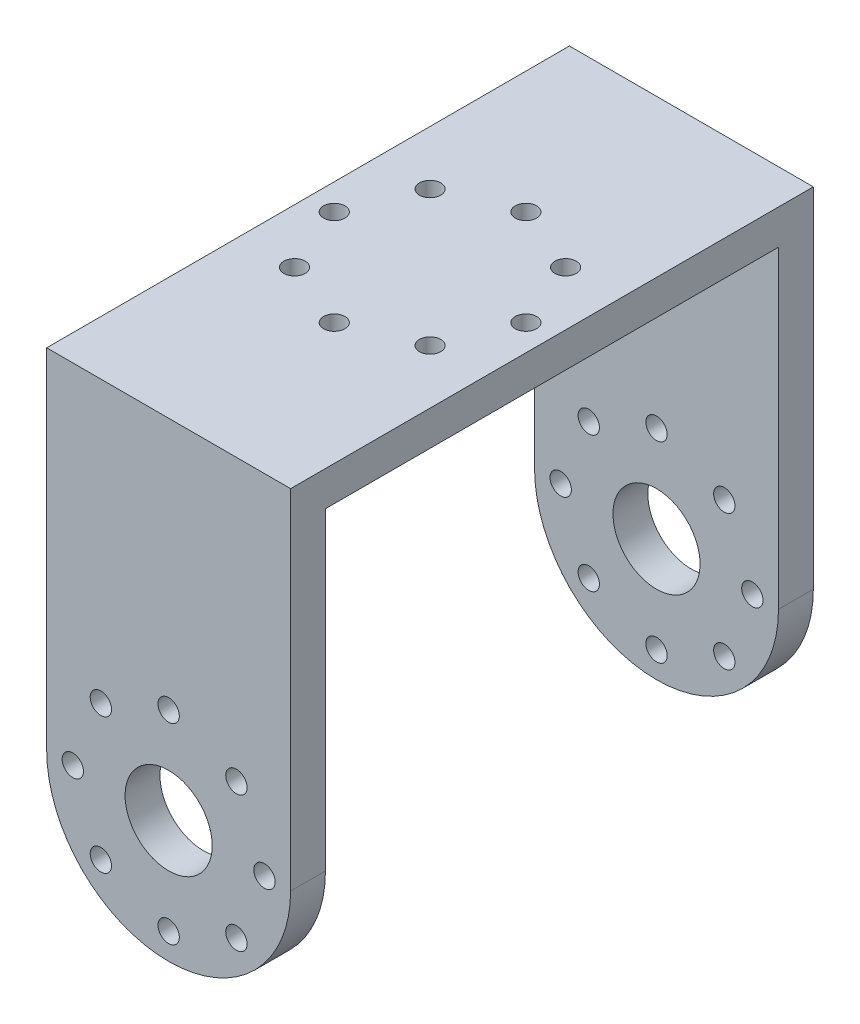
ISO-10303-21;
HEADER;
FILE_DESCRIPTION(('STEP AP214'),'2;1');
FILE_NAME('part.step','',(''),(''),'','','');
FILE_SCHEMA(('AUTOMOTIVE_DESIGN { 1 0 10303 214 1 1 1 1 }'));
ENDSEC;
DATA;
#1=APPLICATION_CONTEXT('core data for automotive mechanical design processes');
#2=APPLICATION_PROTOCOL_DEFINITION('international standard','automotive_design',2000,#1);
#3=PRODUCT_CONTEXT('',#1,'mechanical');
#4=PRODUCT('Part','Part','',(#3));
#5=PRODUCT_RELATED_PRODUCT_CATEGORY('part','',(#4));
#6=PRODUCT_DEFINITION_FORMATION('','',#4);
#7=PRODUCT_DEFINITION_CONTEXT('part definition',#1,'design');
#8=PRODUCT_DEFINITION('design','',#6,#7);
#9=PRODUCT_DEFINITION_SHAPE('','',#8);
#10=(LENGTH_UNIT() NAMED_UNIT(*) SI_UNIT(.MILLI.,.METRE.));
#11=(NAMED_UNIT(*) PLANE_ANGLE_UNIT() SI_UNIT($,.RADIAN.));
#12=(NAMED_UNIT(*) SI_UNIT($,.STERADIAN.) SOLID_ANGLE_UNIT());
#13=UNCERTAINTY_MEASURE_WITH_UNIT(LENGTH_MEASURE(1.E-05),#10,'distance_accuracy_value','');
#14=(GEOMETRIC_REPRESENTATION_CONTEXT(3) GLOBAL_UNCERTAINTY_ASSIGNED_CONTEXT((#13)) GLOBAL_UNIT_ASSIGNED_CONTEXT((#10,
#11,#12)) REPRESENTATION_CONTEXT('',''));
#15=CARTESIAN_POINT('',(0.,0.,0.));
#16=DIRECTION('',(0.,0.,1.));
#17=DIRECTION('',(1.,0.,0.));
#18=AXIS2_PLACEMENT_3D('',#15,#16,#17);
#19=CARTESIAN_POINT('',(0.,0.,60.));
#20=DIRECTION('',(0.,0.,-1.));
#21=DIRECTION('',(-1.,0.,0.));
#22=AXIS2_PLACEMENT_3D('',#19,#20,#21);
#23=CYLINDRICAL_SURFACE('',#22,14.);
#24=CARTESIAN_POINT('',(0.,0.,56.));
#25=DIRECTION('',(0.,0.,1.));
#26=DIRECTION('',(0.,-1.,0.));
#27=AXIS2_PLACEMENT_3D('',#24,#25,#26);
#28=CIRCLE('',#27,14.);
#29=CARTESIAN_POINT('',(-14.,0.,56.));
#30=VERTEX_POINT('',#29);
#31=CARTESIAN_POINT('',(14.,0.,56.));
#32=VERTEX_POINT('',#31);
#33=EDGE_CURVE('E187',#30,#32,#28,.T.);
#34=ORIENTED_EDGE('',*,*,#33,.T.);
#35=DIRECTION('',(0.,0.,-1.));
#36=VECTOR('',#35,1.);
#37=CARTESIAN_POINT('',(14.,0.,60.));
#38=LINE('',#37,#36);
#39=CARTESIAN_POINT('',(14.,0.,60.));
#40=VERTEX_POINT('',#39);
#41=EDGE_CURVE('E42',#40,#32,#38,.T.);
#42=ORIENTED_EDGE('',*,*,#41,.F.);
#43=CARTESIAN_POINT('',(0.,0.,60.));
#44=DIRECTION('',(0.,0.,1.));
#45=DIRECTION('',(1.,0.,0.));
#46=AXIS2_PLACEMENT_3D('',#43,#44,#45);
#47=CIRCLE('',#46,14.);
#48=CARTESIAN_POINT('',(-14.,0.,60.));
#49=VERTEX_POINT('',#48);
#50=EDGE_CURVE('E244',#49,#40,#47,.T.);
#51=ORIENTED_EDGE('',*,*,#50,.F.);
#52=DIRECTION('',(0.,0.,-1.));
#53=VECTOR('',#52,1.);
#54=CARTESIAN_POINT('',(-14.,0.,60.));
#55=LINE('',#54,#53);
#56=EDGE_CURVE('E257',#49,#30,#55,.T.);
#57=ORIENTED_EDGE('',*,*,#56,.T.);
#58=EDGE_LOOP('',(#34,#42,#51,#57));
#59=FACE_BOUND('',#58,.T.);
#60=ADVANCED_FACE('F33',(#59),#23,.T.);
#61=CARTESIAN_POINT('',(0.,0.,60.));
#62=DIRECTION('',(0.,0.,-1.));
#63=DIRECTION('',(-1.,0.,0.));
#64=AXIS2_PLACEMENT_3D('',#61,#62,#63);
#65=CYLINDRICAL_SURFACE('',#64,5.);
#66=CARTESIAN_POINT('',(0.,0.,56.));
#67=DIRECTION('',(0.,0.,1.));
#68=DIRECTION('',(0.,-1.,0.));
#69=AXIS2_PLACEMENT_3D('',#66,#67,#68);
#70=CIRCLE('',#69,5.);
#71=CARTESIAN_POINT('',(0.,-5.,56.));
#72=VERTEX_POINT('',#71);
#73=EDGE_CURVE('E181',#72,#72,#70,.T.);
#74=ORIENTED_EDGE('',*,*,#73,.F.);
#75=EDGE_LOOP('',(#74));
#76=FACE_BOUND('',#75,.T.);
#77=CARTESIAN_POINT('',(0.,0.,60.));
#78=DIRECTION('',(0.,0.,1.));
#79=DIRECTION('',(1.,0.,0.));
#80=AXIS2_PLACEMENT_3D('',#77,#78,#79);
#81=CIRCLE('',#80,5.);
#82=CARTESIAN_POINT('',(5.,0.,60.));
#83=VERTEX_POINT('',#82);
#84=EDGE_CURVE('E238',#83,#83,#81,.T.);
#85=ORIENTED_EDGE('',*,*,#84,.T.);
#86=EDGE_LOOP('',(#85));
#87=FACE_BOUND('',#86,.T.);
#88=ADVANCED_FACE('F370',(#76,#87),#65,.F.);
#89=CARTESIAN_POINT('',(0.,11.,60.));
#90=DIRECTION('',(0.,0.,-1.));
#91=DIRECTION('',(-1.,0.,0.));
#92=AXIS2_PLACEMENT_3D('',#89,#90,#91);
#93=CYLINDRICAL_SURFACE('',#92,1.22499999999995);
#94=CARTESIAN_POINT('',(0.,11.,56.));
#95=DIRECTION('',(0.,0.,1.));
#96=DIRECTION('',(0.,-1.,0.));
#97=AXIS2_PLACEMENT_3D('',#94,#95,#96);
#98=CIRCLE('',#97,1.22499999999995);
#99=CARTESIAN_POINT('',(0.,9.77500000000005,56.));
#100=VERTEX_POINT('',#99);
#101=EDGE_CURVE('E178',#100,#100,#98,.T.);
#102=ORIENTED_EDGE('',*,*,#101,.F.);
#103=EDGE_LOOP('',(#102));
#104=FACE_BOUND('',#103,.T.);
#105=CARTESIAN_POINT('',(0.,11.,60.));
#106=DIRECTION('',(0.,0.,1.));
#107=DIRECTION('',(1.,0.,0.));
#108=AXIS2_PLACEMENT_3D('',#105,#106,#107);
#109=CIRCLE('',#108,1.22499999999995);
#110=CARTESIAN_POINT('',(1.22499999999995,11.,60.));
#111=VERTEX_POINT('',#110);
#112=EDGE_CURVE('E232',#111,#111,#109,.T.);
#113=ORIENTED_EDGE('',*,*,#112,.T.);
#114=EDGE_LOOP('',(#113));
#115=FACE_BOUND('',#114,.T.);
#116=ADVANCED_FACE('F374',(#104,#115),#93,.F.);
#117=CARTESIAN_POINT('',(7.778174593052,7.778174593052,60.));
#118=DIRECTION('',(0.,0.,-1.));
#119=DIRECTION('',(-1.,0.,0.));
#120=AXIS2_PLACEMENT_3D('',#117,#118,#119);
#121=CYLINDRICAL_SURFACE('',#120,1.22499999999995);
#122=CARTESIAN_POINT('',(7.778174593052,7.778174593052,56.));
#123=DIRECTION('',(0.,0.,1.));
#124=DIRECTION('',(0.,-1.,0.));
#125=AXIS2_PLACEMENT_3D('',#122,#123,#124);
#126=CIRCLE('',#125,1.22499999999995);
#127=CARTESIAN_POINT('',(7.778174593052,6.55317459305205,56.));
#128=VERTEX_POINT('',#127);
#129=EDGE_CURVE('E175',#128,#128,#126,.T.);
#130=ORIENTED_EDGE('',*,*,#129,.F.);
#131=EDGE_LOOP('',(#130));
#132=FACE_BOUND('',#131,.T.);
#133=CARTESIAN_POINT('',(7.778174593052,7.778174593052,60.));
#134=DIRECTION('',(0.,0.,1.));
#135=DIRECTION('',(1.,0.,0.));
#136=AXIS2_PLACEMENT_3D('',#133,#134,#135);
#137=CIRCLE('',#136,1.22499999999995);
#138=CARTESIAN_POINT('',(9.00317459305195,7.778174593052,60.));
#139=VERTEX_POINT('',#138);
#140=EDGE_CURVE('E226',#139,#139,#137,.T.);
#141=ORIENTED_EDGE('',*,*,#140,.T.);
#142=EDGE_LOOP('',(#141));
#143=FACE_BOUND('',#142,.T.);
#144=ADVANCED_FACE('F482',(#132,#143),#121,.F.);
#145=CARTESIAN_POINT('',(11.,0.,60.));
#146=DIRECTION('',(0.,0.,-1.));
#147=DIRECTION('',(-1.,0.,0.));
#148=AXIS2_PLACEMENT_3D('',#145,#146,#147);
#149=CYLINDRICAL_SURFACE('',#148,1.22499999999995);
#150=CARTESIAN_POINT('',(11.,0.,56.));
#151=DIRECTION('',(0.,0.,1.));
#152=DIRECTION('',(0.,-1.,0.));
#153=AXIS2_PLACEMENT_3D('',#150,#151,#152);
#154=CIRCLE('',#153,1.22499999999995);
#155=CARTESIAN_POINT('',(11.,-1.22499999999995,56.));
#156=VERTEX_POINT('',#155);
#157=EDGE_CURVE('E172',#156,#156,#154,.T.);
#158=ORIENTED_EDGE('',*,*,#157,.F.);
#159=EDGE_LOOP('',(#158));
#160=FACE_BOUND('',#159,.T.);
#161=CARTESIAN_POINT('',(11.,0.,60.));
#162=DIRECTION('',(0.,0.,1.));
#163=DIRECTION('',(1.,0.,0.));
#164=AXIS2_PLACEMENT_3D('',#161,#162,#163);
#165=CIRCLE('',#164,1.22499999999995);
#166=CARTESIAN_POINT('',(12.225,0.,60.));
#167=VERTEX_POINT('',#166);
#168=EDGE_CURVE('E220',#167,#167,#165,.T.);
#169=ORIENTED_EDGE('',*,*,#168,.T.);
#170=EDGE_LOOP('',(#169));
#171=FACE_BOUND('',#170,.T.);
#172=ADVANCED_FACE('F477',(#160,#171),#149,.F.);
#173=CARTESIAN_POINT('',(7.778174593052,-7.778174593052,60.));
#174=DIRECTION('',(0.,0.,-1.));
#175=DIRECTION('',(-1.,0.,0.));
#176=AXIS2_PLACEMENT_3D('',#173,#174,#175);
#177=CYLINDRICAL_SURFACE('',#176,1.22499999999996);
#178=CARTESIAN_POINT('',(7.778174593052,-7.778174593052,56.));
#179=DIRECTION('',(0.,0.,1.));
#180=DIRECTION('',(0.,-1.,0.));
#181=AXIS2_PLACEMENT_3D('',#178,#179,#180);
#182=CIRCLE('',#181,1.22499999999996);
#183=CARTESIAN_POINT('',(7.778174593052,-9.00317459305196,56.));
#184=VERTEX_POINT('',#183);
#185=EDGE_CURVE('E169',#184,#184,#182,.T.);
#186=ORIENTED_EDGE('',*,*,#185,.F.);
#187=EDGE_LOOP('',(#186));
#188=FACE_BOUND('',#187,.T.);
#189=CARTESIAN_POINT('',(7.778174593052,-7.778174593052,60.));
#190=DIRECTION('',(0.,0.,1.));
#191=DIRECTION('',(1.,0.,0.));
#192=AXIS2_PLACEMENT_3D('',#189,#190,#191);
#193=CIRCLE('',#192,1.22499999999996);
#194=CARTESIAN_POINT('',(9.00317459305196,-7.778174593052,60.));
#195=VERTEX_POINT('',#194);
#196=EDGE_CURVE('E214',#195,#195,#193,.T.);
#197=ORIENTED_EDGE('',*,*,#196,.T.);
#198=EDGE_LOOP('',(#197));
#199=FACE_BOUND('',#198,.T.);
#200=ADVANCED_FACE('F472',(#188,#199),#177,.F.);
#201=CARTESIAN_POINT('',(0.,-11.,60.));
#202=DIRECTION('',(0.,0.,-1.));
#203=DIRECTION('',(-1.,0.,0.));
#204=AXIS2_PLACEMENT_3D('',#201,#202,#203);
#205=CYLINDRICAL_SURFACE('',#204,1.22499999999995);
#206=CARTESIAN_POINT('',(0.,-11.,56.));
#207=DIRECTION('',(0.,0.,1.));
#208=DIRECTION('',(0.,-1.,0.));
#209=AXIS2_PLACEMENT_3D('',#206,#207,#208);
#210=CIRCLE('',#209,1.22499999999995);
#211=CARTESIAN_POINT('',(0.,-12.225,56.));
#212=VERTEX_POINT('',#211);
#213=EDGE_CURVE('E166',#212,#212,#210,.T.);
#214=ORIENTED_EDGE('',*,*,#213,.F.);
#215=EDGE_LOOP('',(#214));
#216=FACE_BOUND('',#215,.T.);
#217=CARTESIAN_POINT('',(0.,-11.,60.));
#218=DIRECTION('',(0.,0.,1.));
#219=DIRECTION('',(1.,0.,0.));
#220=AXIS2_PLACEMENT_3D('',#217,#218,#219);
#221=CIRCLE('',#220,1.22499999999995);
#222=CARTESIAN_POINT('',(1.22499999999995,-11.,60.));
#223=VERTEX_POINT('',#222);
#224=EDGE_CURVE('E208',#223,#223,#221,.T.);
#225=ORIENTED_EDGE('',*,*,#224,.T.);
#226=EDGE_LOOP('',(#225));
#227=FACE_BOUND('',#226,.T.);
#228=ADVANCED_FACE('F467',(#216,#227),#205,.F.);
#229=CARTESIAN_POINT('',(-7.778174593052,-7.778174593052,60.));
#230=DIRECTION('',(0.,0.,-1.));
#231=DIRECTION('',(-1.,0.,0.));
#232=AXIS2_PLACEMENT_3D('',#229,#230,#231);
#233=CYLINDRICAL_SURFACE('',#232,1.22499999999996);
#234=CARTESIAN_POINT('',(-7.778174593052,-7.778174593052,56.));
#235=DIRECTION('',(0.,0.,1.));
#236=DIRECTION('',(0.,-1.,0.));
#237=AXIS2_PLACEMENT_3D('',#234,#235,#236);
#238=CIRCLE('',#237,1.22499999999996);
#239=CARTESIAN_POINT('',(-7.778174593052,-9.00317459305196,56.));
#240=VERTEX_POINT('',#239);
#241=EDGE_CURVE('E163',#240,#240,#238,.T.);
#242=ORIENTED_EDGE('',*,*,#241,.F.);
#243=EDGE_LOOP('',(#242));
#244=FACE_BOUND('',#243,.T.);
#245=CARTESIAN_POINT('',(-7.778174593052,-7.778174593052,60.));
#246=DIRECTION('',(0.,0.,1.));
#247=DIRECTION('',(1.,0.,0.));
#248=AXIS2_PLACEMENT_3D('',#245,#246,#247);
#249=CIRCLE('',#248,1.22499999999996);
#250=CARTESIAN_POINT('',(-6.55317459305204,-7.778174593052,60.));
#251=VERTEX_POINT('',#250);
#252=EDGE_CURVE('E202',#251,#251,#249,.T.);
#253=ORIENTED_EDGE('',*,*,#252,.T.);
#254=EDGE_LOOP('',(#253));
#255=FACE_BOUND('',#254,.T.);
#256=ADVANCED_FACE('F361',(#244,#255),#233,.F.);
#257=CARTESIAN_POINT('',(-11.,0.,60.));
#258=DIRECTION('',(0.,0.,-1.));
#259=DIRECTION('',(-1.,0.,0.));
#260=AXIS2_PLACEMENT_3D('',#257,#258,#259);
#261=CYLINDRICAL_SURFACE('',#260,1.22499999999995);
#262=CARTESIAN_POINT('',(-11.,0.,56.));
#263=DIRECTION('',(0.,0.,1.));
#264=DIRECTION('',(0.,-1.,0.));
#265=AXIS2_PLACEMENT_3D('',#262,#263,#264);
#266=CIRCLE('',#265,1.22499999999995);
#267=CARTESIAN_POINT('',(-11.,-1.22499999999995,56.));
#268=VERTEX_POINT('',#267);
#269=EDGE_CURVE('E160',#268,#268,#266,.T.);
#270=ORIENTED_EDGE('',*,*,#269,.F.);
#271=EDGE_LOOP('',(#270));
#272=FACE_BOUND('',#271,.T.);
#273=CARTESIAN_POINT('',(-11.,0.,60.));
#274=DIRECTION('',(0.,0.,1.));
#275=DIRECTION('',(1.,0.,0.));
#276=AXIS2_PLACEMENT_3D('',#273,#274,#275);
#277=CIRCLE('',#276,1.22499999999995);
#278=CARTESIAN_POINT('',(-9.77500000000005,0.,60.));
#279=VERTEX_POINT('',#278);
#280=EDGE_CURVE('E196',#279,#279,#277,.T.);
#281=ORIENTED_EDGE('',*,*,#280,.T.);
#282=EDGE_LOOP('',(#281));
#283=FACE_BOUND('',#282,.T.);
#284=ADVANCED_FACE('F354',(#272,#283),#261,.F.);
#285=CARTESIAN_POINT('',(-7.778174593052,7.778174593052,60.));
#286=DIRECTION('',(0.,0.,-1.));
#287=DIRECTION('',(-1.,0.,0.));
#288=AXIS2_PLACEMENT_3D('',#285,#286,#287);
#289=CYLINDRICAL_SURFACE('',#288,1.22499999999995);
#290=CARTESIAN_POINT('',(-7.778174593052,7.778174593052,56.));
#291=DIRECTION('',(0.,0.,1.));
#292=DIRECTION('',(0.,-1.,0.));
#293=AXIS2_PLACEMENT_3D('',#290,#291,#292);
#294=CIRCLE('',#293,1.22499999999995);
#295=CARTESIAN_POINT('',(-7.778174593052,6.55317459305205,56.));
#296=VERTEX_POINT('',#295);
#297=EDGE_CURVE('E159',#296,#296,#294,.T.);
#298=ORIENTED_EDGE('',*,*,#297,.F.);
#299=EDGE_LOOP('',(#298));
#300=FACE_BOUND('',#299,.T.);
#301=CARTESIAN_POINT('',(-7.778174593052,7.778174593052,60.));
#302=DIRECTION('',(0.,0.,1.));
#303=DIRECTION('',(1.,0.,0.));
#304=AXIS2_PLACEMENT_3D('',#301,#302,#303);
#305=CIRCLE('',#304,1.22499999999995);
#306=CARTESIAN_POINT('',(-6.55317459305205,7.778174593052,60.));
#307=VERTEX_POINT('',#306);
#308=EDGE_CURVE('E190',#307,#307,#305,.T.);
#309=ORIENTED_EDGE('',*,*,#308,.T.);
#310=EDGE_LOOP('',(#309));
#311=FACE_BOUND('',#310,.T.);
#312=ADVANCED_FACE('F340',(#300,#311),#289,.F.);
#313=CARTESIAN_POINT('',(0.,0.,60.));
#314=DIRECTION('',(0.,0.,1.));
#315=DIRECTION('',(1.,0.,0.));
#316=AXIS2_PLACEMENT_3D('',#313,#314,#315);
#317=PLANE('',#316);
#318=ORIENTED_EDGE('',*,*,#280,.F.);
#319=EDGE_LOOP('',(#318));
#320=FACE_BOUND('',#319,.T.);
#321=ORIENTED_EDGE('',*,*,#224,.F.);
#322=EDGE_LOOP('',(#321));
#323=FACE_BOUND('',#322,.T.);
#324=ORIENTED_EDGE('',*,*,#168,.F.);
#325=EDGE_LOOP('',(#324));
#326=FACE_BOUND('',#325,.T.);
#327=ORIENTED_EDGE('',*,*,#112,.F.);
#328=EDGE_LOOP('',(#327));
#329=FACE_BOUND('',#328,.T.);
#330=ORIENTED_EDGE('',*,*,#50,.T.);
#331=DIRECTION('',(0.,1.,0.));
#332=VECTOR('',#331,1.);
#333=CARTESIAN_POINT('',(14.,0.,60.));
#334=LINE('',#333,#332);
#335=CARTESIAN_POINT('',(14.,40.,60.));
#336=VERTEX_POINT('',#335);
#337=EDGE_CURVE('E89',#40,#336,#334,.T.);
#338=ORIENTED_EDGE('',*,*,#337,.T.);
#339=DIRECTION('',(-1.,0.,0.));
#340=VECTOR('',#339,1.);
#341=CARTESIAN_POINT('',(-14.,40.,60.));
#342=LINE('',#341,#340);
#343=CARTESIAN_POINT('',(-14.,40.,60.));
#344=VERTEX_POINT('',#343);
#345=EDGE_CURVE('E248',#336,#344,#342,.T.);
#346=ORIENTED_EDGE('',*,*,#345,.T.);
#347=DIRECTION('',(0.,-1.,0.));
#348=VECTOR('',#347,1.);
#349=CARTESIAN_POINT('',(-14.,0.,60.));
#350=LINE('',#349,#348);
#351=EDGE_CURVE('E59',#344,#49,#350,.T.);
#352=ORIENTED_EDGE('',*,*,#351,.T.);
#353=EDGE_LOOP('',(#330,#338,#346,#352));
#354=FACE_BOUND('',#353,.T.);
#355=ORIENTED_EDGE('',*,*,#84,.F.);
#356=EDGE_LOOP('',(#355));
#357=FACE_BOUND('',#356,.T.);
#358=ORIENTED_EDGE('',*,*,#140,.F.);
#359=EDGE_LOOP('',(#358));
#360=FACE_BOUND('',#359,.T.);
#361=ORIENTED_EDGE('',*,*,#196,.F.);
#362=EDGE_LOOP('',(#361));
#363=FACE_BOUND('',#362,.T.);
#364=ORIENTED_EDGE('',*,*,#252,.F.);
#365=EDGE_LOOP('',(#364));
#366=FACE_BOUND('',#365,.T.);
#367=ORIENTED_EDGE('',*,*,#308,.F.);
#368=EDGE_LOOP('',(#367));
#369=FACE_BOUND('',#368,.T.);
#370=ADVANCED_FACE('F337',(#320,#323,#326,#329,#354,#357,#360,#363,#366,#369),#317,.T.);
#371=CARTESIAN_POINT('',(0.,0.,0.));
#372=DIRECTION('',(0.,0.,1.));
#373=DIRECTION('',(1.,0.,0.));
#374=AXIS2_PLACEMENT_3D('',#371,#372,#373);
#375=PLANE('',#374);
#376=CARTESIAN_POINT('',(-11.,0.,0.));
#377=DIRECTION('',(0.,0.,1.));
#378=DIRECTION('',(1.,0.,0.));
#379=AXIS2_PLACEMENT_3D('',#376,#377,#378);
#380=CIRCLE('',#379,1.22499999999995);
#381=CARTESIAN_POINT('',(-9.77500000000005,0.,0.));
#382=VERTEX_POINT('',#381);
#383=EDGE_CURVE('E193',#382,#382,#380,.T.);
#384=ORIENTED_EDGE('',*,*,#383,.T.);
#385=EDGE_LOOP('',(#384));
#386=FACE_BOUND('',#385,.T.);
#387=CARTESIAN_POINT('',(0.,-11.,0.));
#388=DIRECTION('',(0.,0.,1.));
#389=DIRECTION('',(1.,0.,0.));
#390=AXIS2_PLACEMENT_3D('',#387,#388,#389);
#391=CIRCLE('',#390,1.22499999999995);
#392=CARTESIAN_POINT('',(1.22499999999995,-11.,0.));
#393=VERTEX_POINT('',#392);
#394=EDGE_CURVE('E205',#393,#393,#391,.T.);
#395=ORIENTED_EDGE('',*,*,#394,.T.);
#396=EDGE_LOOP('',(#395));
#397=FACE_BOUND('',#396,.T.);
#398=CARTESIAN_POINT('',(11.,0.,0.));
#399=DIRECTION('',(0.,0.,1.));
#400=DIRECTION('',(1.,0.,0.));
#401=AXIS2_PLACEMENT_3D('',#398,#399,#400);
#402=CIRCLE('',#401,1.22499999999995);
#403=CARTESIAN_POINT('',(12.225,0.,0.));
#404=VERTEX_POINT('',#403);
#405=EDGE_CURVE('E217',#404,#404,#402,.T.);
#406=ORIENTED_EDGE('',*,*,#405,.T.);
#407=EDGE_LOOP('',(#406));
#408=FACE_BOUND('',#407,.T.);
#409=CARTESIAN_POINT('',(0.,11.,0.));
#410=DIRECTION('',(0.,0.,1.));
#411=DIRECTION('',(1.,0.,0.));
#412=AXIS2_PLACEMENT_3D('',#409,#410,#411);
#413=CIRCLE('',#412,1.22499999999995);
#414=CARTESIAN_POINT('',(1.22499999999995,11.,0.));
#415=VERTEX_POINT('',#414);
#416=EDGE_CURVE('E229',#415,#415,#413,.T.);
#417=ORIENTED_EDGE('',*,*,#416,.T.);
#418=EDGE_LOOP('',(#417));
#419=FACE_BOUND('',#418,.T.);
#420=CARTESIAN_POINT('',(0.,0.,0.));
#421=DIRECTION('',(0.,0.,1.));
#422=DIRECTION('',(1.,0.,0.));
#423=AXIS2_PLACEMENT_3D('',#420,#421,#422);
#424=CIRCLE('',#423,14.);
#425=CARTESIAN_POINT('',(-14.,0.,0.));
#426=VERTEX_POINT('',#425);
#427=CARTESIAN_POINT('',(14.,0.,0.));
#428=VERTEX_POINT('',#427);
#429=EDGE_CURVE('E241',#426,#428,#424,.T.);
#430=ORIENTED_EDGE('',*,*,#429,.F.);
#431=DIRECTION('',(0.,-1.,0.));
#432=VECTOR('',#431,1.);
#433=CARTESIAN_POINT('',(-14.,0.,0.));
#434=LINE('',#433,#432);
#435=CARTESIAN_POINT('',(-14.,40.,0.));
#436=VERTEX_POINT('',#435);
#437=EDGE_CURVE('E246',#436,#426,#434,.T.);
#438=ORIENTED_EDGE('',*,*,#437,.F.);
#439=DIRECTION('',(-1.,0.,0.));
#440=VECTOR('',#439,1.);
#441=CARTESIAN_POINT('',(-14.,40.,0.));
#442=LINE('',#441,#440);
#443=CARTESIAN_POINT('',(14.,40.,0.));
#444=VERTEX_POINT('',#443);
#445=EDGE_CURVE('E254',#444,#436,#442,.T.);
#446=ORIENTED_EDGE('',*,*,#445,.F.);
#447=DIRECTION('',(0.,1.,0.));
#448=VECTOR('',#447,1.);
#449=CARTESIAN_POINT('',(14.,0.,0.));
#450=LINE('',#449,#448);
#451=EDGE_CURVE('E252',#428,#444,#450,.T.);
#452=ORIENTED_EDGE('',*,*,#451,.F.);
#453=EDGE_LOOP('',(#430,#438,#446,#452));
#454=FACE_BOUND('',#453,.T.);
#455=CARTESIAN_POINT('',(0.,0.,0.));
#456=DIRECTION('',(0.,0.,1.));
#457=DIRECTION('',(1.,0.,0.));
#458=AXIS2_PLACEMENT_3D('',#455,#456,#457);
#459=CIRCLE('',#458,5.);
#460=CARTESIAN_POINT('',(5.,0.,0.));
#461=VERTEX_POINT('',#460);
#462=EDGE_CURVE('E235',#461,#461,#459,.T.);
#463=ORIENTED_EDGE('',*,*,#462,.T.);
#464=EDGE_LOOP('',(#463));
#465=FACE_BOUND('',#464,.T.);
#466=CARTESIAN_POINT('',(7.778174593052,7.778174593052,0.));
#467=DIRECTION('',(0.,0.,1.));
#468=DIRECTION('',(1.,0.,0.));
#469=AXIS2_PLACEMENT_3D('',#466,#467,#468);
#470=CIRCLE('',#469,1.22499999999995);
#471=CARTESIAN_POINT('',(9.00317459305195,7.778174593052,0.));
#472=VERTEX_POINT('',#471);
#473=EDGE_CURVE('E223',#472,#472,#470,.T.);
#474=ORIENTED_EDGE('',*,*,#473,.T.);
#475=EDGE_LOOP('',(#474));
#476=FACE_BOUND('',#475,.T.);
#477=CARTESIAN_POINT('',(7.778174593052,-7.778174593052,0.));
#478=DIRECTION('',(0.,0.,1.));
#479=DIRECTION('',(1.,0.,0.));
#480=AXIS2_PLACEMENT_3D('',#477,#478,#479);
#481=CIRCLE('',#480,1.22499999999996);
#482=CARTESIAN_POINT('',(9.00317459305196,-7.778174593052,0.));
#483=VERTEX_POINT('',#482);
#484=EDGE_CURVE('E211',#483,#483,#481,.T.);
#485=ORIENTED_EDGE('',*,*,#484,.T.);
#486=EDGE_LOOP('',(#485));
#487=FACE_BOUND('',#486,.T.);
#488=CARTESIAN_POINT('',(-7.778174593052,-7.778174593052,0.));
#489=DIRECTION('',(0.,0.,1.));
#490=DIRECTION('',(1.,0.,0.));
#491=AXIS2_PLACEMENT_3D('',#488,#489,#490);
#492=CIRCLE('',#491,1.22499999999996);
#493=CARTESIAN_POINT('',(-6.55317459305204,-7.778174593052,0.));
#494=VERTEX_POINT('',#493);
#495=EDGE_CURVE('E199',#494,#494,#492,.T.);
#496=ORIENTED_EDGE('',*,*,#495,.T.);
#497=EDGE_LOOP('',(#496));
#498=FACE_BOUND('',#497,.T.);
#499=CARTESIAN_POINT('',(-7.778174593052,7.778174593052,0.));
#500=DIRECTION('',(0.,0.,1.));
#501=DIRECTION('',(1.,0.,0.));
#502=AXIS2_PLACEMENT_3D('',#499,#500,#501);
#503=CIRCLE('',#502,1.22499999999995);
#504=CARTESIAN_POINT('',(-6.55317459305205,7.778174593052,0.));
#505=VERTEX_POINT('',#504);
#506=EDGE_CURVE('E189',#505,#505,#503,.T.);
#507=ORIENTED_EDGE('',*,*,#506,.T.);
#508=EDGE_LOOP('',(#507));
#509=FACE_BOUND('',#508,.T.);
#510=ADVANCED_FACE('F332',(#386,#397,#408,#419,#454,#465,#476,#487,#498,#509),#375,.F.);
#511=CARTESIAN_POINT('',(14.,0.,4.));
#512=VERTEX_POINT('',#511);
#513=EDGE_CURVE('E266',#512,#428,#38,.T.);
#514=ORIENTED_EDGE('',*,*,#513,.F.);
#515=CARTESIAN_POINT('',(0.,0.,4.));
#516=DIRECTION('',(0.,0.,-1.));
#517=DIRECTION('',(0.,1.,0.));
#518=AXIS2_PLACEMENT_3D('',#515,#516,#517);
#519=CIRCLE('',#518,14.);
#520=CARTESIAN_POINT('',(-14.,0.,4.));
#521=VERTEX_POINT('',#520);
#522=EDGE_CURVE('E121',#512,#521,#519,.T.);
#523=ORIENTED_EDGE('',*,*,#522,.T.);
#524=EDGE_CURVE('E81',#521,#426,#55,.T.);
#525=ORIENTED_EDGE('',*,*,#524,.T.);
#526=ORIENTED_EDGE('',*,*,#429,.T.);
#527=EDGE_LOOP('',(#514,#523,#525,#526));
#528=FACE_BOUND('',#527,.T.);
#529=ADVANCED_FACE('F35',(#528),#23,.T.);
#530=CARTESIAN_POINT('',(14.,0.,60.));
#531=DIRECTION('',(-1.,0.,0.));
#532=DIRECTION('',(0.,0.,1.));
#533=AXIS2_PLACEMENT_3D('',#530,#531,#532);
#534=PLANE('',#533);
#535=ORIENTED_EDGE('',*,*,#41,.T.);
#536=DIRECTION('',(0.,-1.,0.));
#537=VECTOR('',#536,1.);
#538=CARTESIAN_POINT('',(14.,36.,56.));
#539=LINE('',#538,#537);
#540=CARTESIAN_POINT('',(14.,36.,56.));
#541=VERTEX_POINT('',#540);
#542=EDGE_CURVE('E123',#541,#32,#539,.T.);
#543=ORIENTED_EDGE('',*,*,#542,.F.);
#544=DIRECTION('',(0.,0.,1.));
#545=VECTOR('',#544,1.);
#546=CARTESIAN_POINT('',(14.,36.,56.));
#547=LINE('',#546,#545);
#548=CARTESIAN_POINT('',(14.,36.,4.));
#549=VERTEX_POINT('',#548);
#550=EDGE_CURVE('E113',#549,#541,#547,.T.);
#551=ORIENTED_EDGE('',*,*,#550,.F.);
#552=DIRECTION('',(0.,1.,0.));
#553=VECTOR('',#552,1.);
#554=CARTESIAN_POINT('',(14.,36.,4.));
#555=LINE('',#554,#553);
#556=EDGE_CURVE('E119',#512,#549,#555,.T.);
#557=ORIENTED_EDGE('',*,*,#556,.F.);
#558=ORIENTED_EDGE('',*,*,#513,.T.);
#559=ORIENTED_EDGE('',*,*,#451,.T.);
#560=DIRECTION('',(0.,0.,-1.));
#561=VECTOR('',#560,1.);
#562=CARTESIAN_POINT('',(14.,40.,60.));
#563=LINE('',#562,#561);
#564=EDGE_CURVE('E263',#336,#444,#563,.T.);
#565=ORIENTED_EDGE('',*,*,#564,.F.);
#566=ORIENTED_EDGE('',*,*,#337,.F.);
#567=EDGE_LOOP('',(#535,#543,#551,#557,#558,#559,#565,#566));
#568=FACE_BOUND('',#567,.T.);
#569=ADVANCED_FACE('F125',(#568),#534,.F.);
#570=CARTESIAN_POINT('',(-14.,40.,60.));
#571=DIRECTION('',(0.,-1.,0.));
#572=DIRECTION('',(0.,0.,-1.));
#573=AXIS2_PLACEMENT_3D('',#570,#571,#572);
#574=PLANE('',#573);
#575=CARTESIAN_POINT('',(-10.9966002853062,40.,29.9936572976104));
#576=DIRECTION('',(0.,1.,0.));
#577=DIRECTION('',(0.,0.,1.));
#578=AXIS2_PLACEMENT_3D('',#575,#576,#577);
#579=CIRCLE('',#578,1.22499999997747);
#580=CARTESIAN_POINT('',(-10.9966002853062,40.,31.2186572975878));
#581=VERTEX_POINT('',#580);
#582=EDGE_CURVE('E307',#581,#581,#579,.T.);
#583=ORIENTED_EDGE('',*,*,#582,.F.);
#584=EDGE_LOOP('',(#583));
#585=FACE_BOUND('',#584,.T.);
#586=CARTESIAN_POINT('',(-7.77477487835823,40.,37.7718318906624));
#587=DIRECTION('',(0.,1.,0.));
#588=DIRECTION('',(0.,0.,1.));
#589=AXIS2_PLACEMENT_3D('',#586,#587,#588);
#590=CIRCLE('',#589,1.22499999997747);
#591=CARTESIAN_POINT('',(-7.77477487835823,40.,38.9968318906398));
#592=VERTEX_POINT('',#591);
#593=EDGE_CURVE('E297',#592,#592,#590,.T.);
#594=ORIENTED_EDGE('',*,*,#593,.F.);
#595=EDGE_LOOP('',(#594));
#596=FACE_BOUND('',#595,.T.);
#597=CARTESIAN_POINT('',(0.00339971469376713,40.,40.9936572976104));
#598=DIRECTION('',(0.,1.,0.));
#599=DIRECTION('',(0.,0.,1.));
#600=AXIS2_PLACEMENT_3D('',#597,#598,#599);
#601=CIRCLE('',#600,1.22499999997748);
#602=CARTESIAN_POINT('',(0.00339971469376713,40.,42.2186572975879));
#603=VERTEX_POINT('',#602);
#604=EDGE_CURVE('E294',#603,#603,#601,.T.);
#605=ORIENTED_EDGE('',*,*,#604,.F.);
#606=EDGE_LOOP('',(#605));
#607=FACE_BOUND('',#606,.T.);
#608=CARTESIAN_POINT('',(7.78157430774577,40.,37.7718318906624));
#609=DIRECTION('',(0.,1.,0.));
#610=DIRECTION('',(0.,0.,1.));
#611=AXIS2_PLACEMENT_3D('',#608,#609,#610);
#612=CIRCLE('',#611,1.22499999997747);
#613=CARTESIAN_POINT('',(7.78157430774577,40.,38.9968318906398));
#614=VERTEX_POINT('',#613);
#615=EDGE_CURVE('E291',#614,#614,#612,.T.);
#616=ORIENTED_EDGE('',*,*,#615,.F.);
#617=EDGE_LOOP('',(#616));
#618=FACE_BOUND('',#617,.T.);
#619=CARTESIAN_POINT('',(11.0033997146938,40.,29.9936572976104));
#620=DIRECTION('',(0.,1.,0.));
#621=DIRECTION('',(0.,0.,1.));
#622=AXIS2_PLACEMENT_3D('',#619,#620,#621);
#623=CIRCLE('',#622,1.22499999997747);
#624=CARTESIAN_POINT('',(11.0033997146938,40.,31.2186572975878));
#625=VERTEX_POINT('',#624);
#626=EDGE_CURVE('E287',#625,#625,#623,.T.);
#627=ORIENTED_EDGE('',*,*,#626,.F.);
#628=EDGE_LOOP('',(#627));
#629=FACE_BOUND('',#628,.T.);
#630=CARTESIAN_POINT('',(7.78157430774577,40.,22.2154827045584));
#631=DIRECTION('',(0.,1.,0.));
#632=DIRECTION('',(0.,0.,1.));
#633=AXIS2_PLACEMENT_3D('',#630,#631,#632);
#634=CIRCLE('',#633,1.22499999997747);
#635=CARTESIAN_POINT('',(7.78157430774577,40.,23.4404827045359));
#636=VERTEX_POINT('',#635);
#637=EDGE_CURVE('E283',#636,#636,#634,.T.);
#638=ORIENTED_EDGE('',*,*,#637,.F.);
#639=EDGE_LOOP('',(#638));
#640=FACE_BOUND('',#639,.T.);
#641=CARTESIAN_POINT('',(0.00339971469376713,40.,18.9936572976104));
#642=DIRECTION('',(0.,1.,0.));
#643=DIRECTION('',(0.,0.,1.));
#644=AXIS2_PLACEMENT_3D('',#641,#642,#643);
#645=CIRCLE('',#644,1.22499999997748);
#646=CARTESIAN_POINT('',(0.00339971469376713,40.,20.2186572975879));
#647=VERTEX_POINT('',#646);
#648=EDGE_CURVE('E279',#647,#647,#645,.T.);
#649=ORIENTED_EDGE('',*,*,#648,.F.);
#650=EDGE_LOOP('',(#649));
#651=FACE_BOUND('',#650,.T.);
#652=CARTESIAN_POINT('',(-7.77477487835823,40.,22.2154827045584));
#653=DIRECTION('',(0.,1.,0.));
#654=DIRECTION('',(0.,0.,1.));
#655=AXIS2_PLACEMENT_3D('',#652,#653,#654);
#656=CIRCLE('',#655,1.22499999997747);
#657=CARTESIAN_POINT('',(-7.77477487835823,40.,23.4404827045359));
#658=VERTEX_POINT('',#657);
#659=EDGE_CURVE('E275',#658,#658,#656,.T.);
#660=ORIENTED_EDGE('',*,*,#659,.F.);
#661=EDGE_LOOP('',(#660));
#662=FACE_BOUND('',#661,.T.);
#663=ORIENTED_EDGE('',*,*,#445,.T.);
#664=DIRECTION('',(0.,0.,-1.));
#665=VECTOR('',#664,1.);
#666=CARTESIAN_POINT('',(-14.,40.,60.));
#667=LINE('',#666,#665);
#668=EDGE_CURVE('E260',#344,#436,#667,.T.);
#669=ORIENTED_EDGE('',*,*,#668,.F.);
#670=ORIENTED_EDGE('',*,*,#345,.F.);
#671=ORIENTED_EDGE('',*,*,#564,.T.);
#672=EDGE_LOOP('',(#663,#669,#670,#671));
#673=FACE_BOUND('',#672,.T.);
#674=ADVANCED_FACE('F336',(#585,#596,#607,#618,#629,#640,#651,#662,#673),#574,.F.);
#675=CARTESIAN_POINT('',(-14.,0.,60.));
#676=DIRECTION('',(1.,0.,0.));
#677=DIRECTION('',(0.,0.,-1.));
#678=AXIS2_PLACEMENT_3D('',#675,#676,#677);
#679=PLANE('',#678);
#680=DIRECTION('',(0.,0.,1.));
#681=VECTOR('',#680,1.);
#682=CARTESIAN_POINT('',(-14.,36.,60.));
#683=LINE('',#682,#681);
#684=CARTESIAN_POINT('',(-14.,36.,4.));
#685=VERTEX_POINT('',#684);
#686=CARTESIAN_POINT('',(-14.,36.,56.));
#687=VERTEX_POINT('',#686);
#688=EDGE_CURVE('E11',#685,#687,#683,.T.);
#689=ORIENTED_EDGE('',*,*,#688,.T.);
#690=DIRECTION('',(0.,-1.,0.));
#691=VECTOR('',#690,1.);
#692=CARTESIAN_POINT('',(-14.,0.,56.));
#693=LINE('',#692,#691);
#694=EDGE_CURVE('E184',#687,#30,#693,.T.);
#695=ORIENTED_EDGE('',*,*,#694,.T.);
#696=ORIENTED_EDGE('',*,*,#56,.F.);
#697=ORIENTED_EDGE('',*,*,#351,.F.);
#698=ORIENTED_EDGE('',*,*,#668,.T.);
#699=ORIENTED_EDGE('',*,*,#437,.T.);
#700=ORIENTED_EDGE('',*,*,#524,.F.);
#701=DIRECTION('',(0.,1.,0.));
#702=VECTOR('',#701,1.);
#703=CARTESIAN_POINT('',(-14.,0.,4.));
#704=LINE('',#703,#702);
#705=EDGE_CURVE('E156',#521,#685,#704,.T.);
#706=ORIENTED_EDGE('',*,*,#705,.T.);
#707=EDGE_LOOP('',(#689,#695,#696,#697,#698,#699,#700,#706));
#708=FACE_BOUND('',#707,.T.);
#709=ADVANCED_FACE('F325',(#708),#679,.F.);
#710=CARTESIAN_POINT('',(0.,0.,4.));
#711=DIRECTION('',(0.,0.,-1.));
#712=DIRECTION('',(0.,1.,0.));
#713=AXIS2_PLACEMENT_3D('',#710,#711,#712);
#714=CIRCLE('',#713,5.);
#715=CARTESIAN_POINT('',(0.,5.,4.));
#716=VERTEX_POINT('',#715);
#717=EDGE_CURVE('E153',#716,#716,#714,.T.);
#718=ORIENTED_EDGE('',*,*,#717,.F.);
#719=EDGE_LOOP('',(#718));
#720=FACE_BOUND('',#719,.T.);
#721=ORIENTED_EDGE('',*,*,#462,.F.);
#722=EDGE_LOOP('',(#721));
#723=FACE_BOUND('',#722,.T.);
#724=ADVANCED_FACE('F377',(#720,#723),#65,.F.);
#725=CARTESIAN_POINT('',(0.,11.,4.));
#726=DIRECTION('',(0.,0.,-1.));
#727=DIRECTION('',(0.,1.,0.));
#728=AXIS2_PLACEMENT_3D('',#725,#726,#727);
#729=CIRCLE('',#728,1.22499999999995);
#730=CARTESIAN_POINT('',(0.,12.225,4.));
#731=VERTEX_POINT('',#730);
#732=EDGE_CURVE('E150',#731,#731,#729,.T.);
#733=ORIENTED_EDGE('',*,*,#732,.F.);
#734=EDGE_LOOP('',(#733));
#735=FACE_BOUND('',#734,.T.);
#736=ORIENTED_EDGE('',*,*,#416,.F.);
#737=EDGE_LOOP('',(#736));
#738=FACE_BOUND('',#737,.T.);
#739=ADVANCED_FACE('F480',(#735,#738),#93,.F.);
#740=CARTESIAN_POINT('',(7.778174593052,7.778174593052,4.));
#741=DIRECTION('',(0.,0.,-1.));
#742=DIRECTION('',(0.,1.,0.));
#743=AXIS2_PLACEMENT_3D('',#740,#741,#742);
#744=CIRCLE('',#743,1.22499999999995);
#745=CARTESIAN_POINT('',(7.778174593052,9.00317459305195,4.));
#746=VERTEX_POINT('',#745);
#747=EDGE_CURVE('E147',#746,#746,#744,.T.);
#748=ORIENTED_EDGE('',*,*,#747,.F.);
#749=EDGE_LOOP('',(#748));
#750=FACE_BOUND('',#749,.T.);
#751=ORIENTED_EDGE('',*,*,#473,.F.);
#752=EDGE_LOOP('',(#751));
#753=FACE_BOUND('',#752,.T.);
#754=ADVANCED_FACE('F475',(#750,#753),#121,.F.);
#755=CARTESIAN_POINT('',(11.,0.,4.));
#756=DIRECTION('',(0.,0.,-1.));
#757=DIRECTION('',(0.,1.,0.));
#758=AXIS2_PLACEMENT_3D('',#755,#756,#757);
#759=CIRCLE('',#758,1.22499999999995);
#760=CARTESIAN_POINT('',(11.,1.22499999999995,4.));
#761=VERTEX_POINT('',#760);
#762=EDGE_CURVE('E144',#761,#761,#759,.T.);
#763=ORIENTED_EDGE('',*,*,#762,.F.);
#764=EDGE_LOOP('',(#763));
#765=FACE_BOUND('',#764,.T.);
#766=ORIENTED_EDGE('',*,*,#405,.F.);
#767=EDGE_LOOP('',(#766));
#768=FACE_BOUND('',#767,.T.);
#769=ADVANCED_FACE('F470',(#765,#768),#149,.F.);
#770=CARTESIAN_POINT('',(7.778174593052,-7.778174593052,4.));
#771=DIRECTION('',(0.,0.,-1.));
#772=DIRECTION('',(0.,1.,0.));
#773=AXIS2_PLACEMENT_3D('',#770,#771,#772);
#774=CIRCLE('',#773,1.22499999999996);
#775=CARTESIAN_POINT('',(7.778174593052,-6.55317459305204,4.));
#776=VERTEX_POINT('',#775);
#777=EDGE_CURVE('E141',#776,#776,#774,.T.);
#778=ORIENTED_EDGE('',*,*,#777,.F.);
#779=EDGE_LOOP('',(#778));
#780=FACE_BOUND('',#779,.T.);
#781=ORIENTED_EDGE('',*,*,#484,.F.);
#782=EDGE_LOOP('',(#781));
#783=FACE_BOUND('',#782,.T.);
#784=ADVANCED_FACE('F465',(#780,#783),#177,.F.);
#785=CARTESIAN_POINT('',(0.,-11.,4.));
#786=DIRECTION('',(0.,0.,-1.));
#787=DIRECTION('',(0.,1.,0.));
#788=AXIS2_PLACEMENT_3D('',#785,#786,#787);
#789=CIRCLE('',#788,1.22499999999995);
#790=CARTESIAN_POINT('',(0.,-9.77500000000005,4.));
#791=VERTEX_POINT('',#790);
#792=EDGE_CURVE('E138',#791,#791,#789,.T.);
#793=ORIENTED_EDGE('',*,*,#792,.F.);
#794=EDGE_LOOP('',(#793));
#795=FACE_BOUND('',#794,.T.);
#796=ORIENTED_EDGE('',*,*,#394,.F.);
#797=EDGE_LOOP('',(#796));
#798=FACE_BOUND('',#797,.T.);
#799=ADVANCED_FACE('F459',(#795,#798),#205,.F.);
#800=CARTESIAN_POINT('',(-7.778174593052,-7.778174593052,4.));
#801=DIRECTION('',(0.,0.,-1.));
#802=DIRECTION('',(0.,1.,0.));
#803=AXIS2_PLACEMENT_3D('',#800,#801,#802);
#804=CIRCLE('',#803,1.22499999999996);
#805=CARTESIAN_POINT('',(-7.778174593052,-6.55317459305204,4.));
#806=VERTEX_POINT('',#805);
#807=EDGE_CURVE('E135',#806,#806,#804,.T.);
#808=ORIENTED_EDGE('',*,*,#807,.F.);
#809=EDGE_LOOP('',(#808));
#810=FACE_BOUND('',#809,.T.);
#811=ORIENTED_EDGE('',*,*,#495,.F.);
#812=EDGE_LOOP('',(#811));
#813=FACE_BOUND('',#812,.T.);
#814=ADVANCED_FACE('F454',(#810,#813),#233,.F.);
#815=CARTESIAN_POINT('',(-11.,0.,4.));
#816=DIRECTION('',(0.,0.,-1.));
#817=DIRECTION('',(0.,1.,0.));
#818=AXIS2_PLACEMENT_3D('',#815,#816,#817);
#819=CIRCLE('',#818,1.22499999999995);
#820=CARTESIAN_POINT('',(-11.,1.22499999999995,4.));
#821=VERTEX_POINT('',#820);
#822=EDGE_CURVE('E132',#821,#821,#819,.T.);
#823=ORIENTED_EDGE('',*,*,#822,.F.);
#824=EDGE_LOOP('',(#823));
#825=FACE_BOUND('',#824,.T.);
#826=ORIENTED_EDGE('',*,*,#383,.F.);
#827=EDGE_LOOP('',(#826));
#828=FACE_BOUND('',#827,.T.);
#829=ADVANCED_FACE('F364',(#825,#828),#261,.F.);
#830=CARTESIAN_POINT('',(-7.778174593052,7.778174593052,4.));
#831=DIRECTION('',(0.,0.,-1.));
#832=DIRECTION('',(0.,1.,0.));
#833=AXIS2_PLACEMENT_3D('',#830,#831,#832);
#834=CIRCLE('',#833,1.22499999999995);
#835=CARTESIAN_POINT('',(-7.778174593052,9.00317459305195,4.));
#836=VERTEX_POINT('',#835);
#837=EDGE_CURVE('E130',#836,#836,#834,.T.);
#838=ORIENTED_EDGE('',*,*,#837,.F.);
#839=EDGE_LOOP('',(#838));
#840=FACE_BOUND('',#839,.T.);
#841=ORIENTED_EDGE('',*,*,#506,.F.);
#842=EDGE_LOOP('',(#841));
#843=FACE_BOUND('',#842,.T.);
#844=ADVANCED_FACE('F357',(#840,#843),#289,.F.);
#845=CARTESIAN_POINT('',(-46.,36.,56.));
#846=DIRECTION('',(0.,1.,0.));
#847=DIRECTION('',(0.,0.,1.));
#848=AXIS2_PLACEMENT_3D('',#845,#846,#847);
#849=PLANE('',#848);
#850=CARTESIAN_POINT('',(-10.9966002853062,36.,29.9936572976104));
#851=DIRECTION('',(0.,1.,0.));
#852=DIRECTION('',(0.,0.,1.));
#853=AXIS2_PLACEMENT_3D('',#850,#851,#852);
#854=CIRCLE('',#853,1.22499999997747);
#855=CARTESIAN_POINT('',(-10.9966002853062,36.,31.2186572975878));
#856=VERTEX_POINT('',#855);
#857=EDGE_CURVE('E37',#856,#856,#854,.T.);
#858=ORIENTED_EDGE('',*,*,#857,.T.);
#859=EDGE_LOOP('',(#858));
#860=FACE_BOUND('',#859,.T.);
#861=CARTESIAN_POINT('',(-7.77477487835823,36.,37.7718318906624));
#862=DIRECTION('',(0.,1.,0.));
#863=DIRECTION('',(0.,0.,1.));
#864=AXIS2_PLACEMENT_3D('',#861,#862,#863);
#865=CIRCLE('',#864,1.22499999997747);
#866=CARTESIAN_POINT('',(-7.77477487835823,36.,38.9968318906398));
#867=VERTEX_POINT('',#866);
#868=EDGE_CURVE('E295',#867,#867,#865,.T.);
#869=ORIENTED_EDGE('',*,*,#868,.T.);
#870=EDGE_LOOP('',(#869));
#871=FACE_BOUND('',#870,.T.);
#872=CARTESIAN_POINT('',(0.00339971469376713,36.,40.9936572976104));
#873=DIRECTION('',(0.,1.,0.));
#874=DIRECTION('',(0.,0.,1.));
#875=AXIS2_PLACEMENT_3D('',#872,#873,#874);
#876=CIRCLE('',#875,1.22499999997748);
#877=CARTESIAN_POINT('',(0.00339971469376713,36.,42.2186572975879));
#878=VERTEX_POINT('',#877);
#879=EDGE_CURVE('E292',#878,#878,#876,.T.);
#880=ORIENTED_EDGE('',*,*,#879,.T.);
#881=EDGE_LOOP('',(#880));
#882=FACE_BOUND('',#881,.T.);
#883=CARTESIAN_POINT('',(7.78157430774577,36.,37.7718318906624));
#884=DIRECTION('',(0.,1.,0.));
#885=DIRECTION('',(0.,0.,1.));
#886=AXIS2_PLACEMENT_3D('',#883,#884,#885);
#887=CIRCLE('',#886,1.22499999997747);
#888=CARTESIAN_POINT('',(7.78157430774577,36.,38.9968318906398));
#889=VERTEX_POINT('',#888);
#890=EDGE_CURVE('E288',#889,#889,#887,.T.);
#891=ORIENTED_EDGE('',*,*,#890,.T.);
#892=EDGE_LOOP('',(#891));
#893=FACE_BOUND('',#892,.T.);
#894=CARTESIAN_POINT('',(11.0033997146938,36.,29.9936572976104));
#895=DIRECTION('',(0.,1.,0.));
#896=DIRECTION('',(0.,0.,1.));
#897=AXIS2_PLACEMENT_3D('',#894,#895,#896);
#898=CIRCLE('',#897,1.22499999997747);
#899=CARTESIAN_POINT('',(11.0033997146938,36.,31.2186572975878));
#900=VERTEX_POINT('',#899);
#901=EDGE_CURVE('E284',#900,#900,#898,.T.);
#902=ORIENTED_EDGE('',*,*,#901,.T.);
#903=EDGE_LOOP('',(#902));
#904=FACE_BOUND('',#903,.T.);
#905=CARTESIAN_POINT('',(7.78157430774577,36.,22.2154827045584));
#906=DIRECTION('',(0.,1.,0.));
#907=DIRECTION('',(0.,0.,1.));
#908=AXIS2_PLACEMENT_3D('',#905,#906,#907);
#909=CIRCLE('',#908,1.22499999997747);
#910=CARTESIAN_POINT('',(7.78157430774577,36.,23.4404827045359));
#911=VERTEX_POINT('',#910);
#912=EDGE_CURVE('E280',#911,#911,#909,.T.);
#913=ORIENTED_EDGE('',*,*,#912,.T.);
#914=EDGE_LOOP('',(#913));
#915=FACE_BOUND('',#914,.T.);
#916=CARTESIAN_POINT('',(0.00339971469376713,36.,18.9936572976104));
#917=DIRECTION('',(0.,1.,0.));
#918=DIRECTION('',(0.,0.,1.));
#919=AXIS2_PLACEMENT_3D('',#916,#917,#918);
#920=CIRCLE('',#919,1.22499999997748);
#921=CARTESIAN_POINT('',(0.00339971469376713,36.,20.2186572975879));
#922=VERTEX_POINT('',#921);
#923=EDGE_CURVE('E276',#922,#922,#920,.T.);
#924=ORIENTED_EDGE('',*,*,#923,.T.);
#925=EDGE_LOOP('',(#924));
#926=FACE_BOUND('',#925,.T.);
#927=CARTESIAN_POINT('',(-7.77477487835823,36.,22.2154827045584));
#928=DIRECTION('',(0.,1.,0.));
#929=DIRECTION('',(0.,0.,1.));
#930=AXIS2_PLACEMENT_3D('',#927,#928,#929);
#931=CIRCLE('',#930,1.22499999997747);
#932=CARTESIAN_POINT('',(-7.77477487835823,36.,23.4404827045359));
#933=VERTEX_POINT('',#932);
#934=EDGE_CURVE('E272',#933,#933,#931,.T.);
#935=ORIENTED_EDGE('',*,*,#934,.T.);
#936=EDGE_LOOP('',(#935));
#937=FACE_BOUND('',#936,.T.);
#938=DIRECTION('',(1.,0.,0.));
#939=VECTOR('',#938,1.);
#940=CARTESIAN_POINT('',(-46.,36.,4.));
#941=LINE('',#940,#939);
#942=EDGE_CURVE('E50',#685,#549,#941,.T.);
#943=ORIENTED_EDGE('',*,*,#942,.T.);
#944=ORIENTED_EDGE('',*,*,#550,.T.);
#945=DIRECTION('',(1.,0.,0.));
#946=VECTOR('',#945,1.);
#947=CARTESIAN_POINT('',(-46.,36.,56.));
#948=LINE('',#947,#946);
#949=EDGE_CURVE('E116',#687,#541,#948,.T.);
#950=ORIENTED_EDGE('',*,*,#949,.F.);
#951=ORIENTED_EDGE('',*,*,#688,.F.);
#952=EDGE_LOOP('',(#943,#944,#950,#951));
#953=FACE_BOUND('',#952,.T.);
#954=ADVANCED_FACE('F110',(#860,#871,#882,#893,#904,#915,#926,#937,#953),#849,.F.);
#955=CARTESIAN_POINT('',(-46.,36.,56.));
#956=DIRECTION('',(0.,0.,1.));
#957=DIRECTION('',(0.,-1.,0.));
#958=AXIS2_PLACEMENT_3D('',#955,#956,#957);
#959=PLANE('',#958);
#960=ORIENTED_EDGE('',*,*,#73,.T.);
#961=EDGE_LOOP('',(#960));
#962=FACE_BOUND('',#961,.T.);
#963=ORIENTED_EDGE('',*,*,#101,.T.);
#964=EDGE_LOOP('',(#963));
#965=FACE_BOUND('',#964,.T.);
#966=ORIENTED_EDGE('',*,*,#129,.T.);
#967=EDGE_LOOP('',(#966));
#968=FACE_BOUND('',#967,.T.);
#969=ORIENTED_EDGE('',*,*,#157,.T.);
#970=EDGE_LOOP('',(#969));
#971=FACE_BOUND('',#970,.T.);
#972=ORIENTED_EDGE('',*,*,#185,.T.);
#973=EDGE_LOOP('',(#972));
#974=FACE_BOUND('',#973,.T.);
#975=ORIENTED_EDGE('',*,*,#213,.T.);
#976=EDGE_LOOP('',(#975));
#977=FACE_BOUND('',#976,.T.);
#978=ORIENTED_EDGE('',*,*,#241,.T.);
#979=EDGE_LOOP('',(#978));
#980=FACE_BOUND('',#979,.T.);
#981=ORIENTED_EDGE('',*,*,#269,.T.);
#982=EDGE_LOOP('',(#981));
#983=FACE_BOUND('',#982,.T.);
#984=ORIENTED_EDGE('',*,*,#297,.T.);
#985=EDGE_LOOP('',(#984));
#986=FACE_BOUND('',#985,.T.);
#987=ORIENTED_EDGE('',*,*,#33,.F.);
#988=ORIENTED_EDGE('',*,*,#694,.F.);
#989=ORIENTED_EDGE('',*,*,#949,.T.);
#990=ORIENTED_EDGE('',*,*,#542,.T.);
#991=EDGE_LOOP('',(#987,#988,#989,#990));
#992=FACE_BOUND('',#991,.T.);
#993=ADVANCED_FACE('F320',(#962,#965,#968,#971,#974,#977,#980,#983,#986,#992),#959,.F.);
#994=CARTESIAN_POINT('',(-46.,36.,4.));
#995=DIRECTION('',(0.,0.,-1.));
#996=DIRECTION('',(0.,1.,0.));
#997=AXIS2_PLACEMENT_3D('',#994,#995,#996);
#998=PLANE('',#997);
#999=ORIENTED_EDGE('',*,*,#717,.T.);
#1000=EDGE_LOOP('',(#999));
#1001=FACE_BOUND('',#1000,.T.);
#1002=ORIENTED_EDGE('',*,*,#732,.T.);
#1003=EDGE_LOOP('',(#1002));
#1004=FACE_BOUND('',#1003,.T.);
#1005=ORIENTED_EDGE('',*,*,#747,.T.);
#1006=EDGE_LOOP('',(#1005));
#1007=FACE_BOUND('',#1006,.T.);
#1008=ORIENTED_EDGE('',*,*,#762,.T.);
#1009=EDGE_LOOP('',(#1008));
#1010=FACE_BOUND('',#1009,.T.);
#1011=ORIENTED_EDGE('',*,*,#777,.T.);
#1012=EDGE_LOOP('',(#1011));
#1013=FACE_BOUND('',#1012,.T.);
#1014=ORIENTED_EDGE('',*,*,#792,.T.);
#1015=EDGE_LOOP('',(#1014));
#1016=FACE_BOUND('',#1015,.T.);
#1017=ORIENTED_EDGE('',*,*,#807,.T.);
#1018=EDGE_LOOP('',(#1017));
#1019=FACE_BOUND('',#1018,.T.);
#1020=ORIENTED_EDGE('',*,*,#822,.T.);
#1021=EDGE_LOOP('',(#1020));
#1022=FACE_BOUND('',#1021,.T.);
#1023=ORIENTED_EDGE('',*,*,#837,.T.);
#1024=EDGE_LOOP('',(#1023));
#1025=FACE_BOUND('',#1024,.T.);
#1026=ORIENTED_EDGE('',*,*,#556,.T.);
#1027=ORIENTED_EDGE('',*,*,#942,.F.);
#1028=ORIENTED_EDGE('',*,*,#705,.F.);
#1029=ORIENTED_EDGE('',*,*,#522,.F.);
#1030=EDGE_LOOP('',(#1026,#1027,#1028,#1029));
#1031=FACE_BOUND('',#1030,.T.);
#1032=ADVANCED_FACE('F120',(#1001,#1004,#1007,#1010,#1013,#1016,#1019,#1022,#1025,#1031),#998,.F.);
#1033=CARTESIAN_POINT('',(-7.77477487835823,-20.,22.2154827045584));
#1034=DIRECTION('',(0.,1.,0.));
#1035=DIRECTION('',(0.,0.,1.));
#1036=AXIS2_PLACEMENT_3D('',#1033,#1034,#1035);
#1037=CYLINDRICAL_SURFACE('',#1036,1.22499999997747);
#1038=ORIENTED_EDGE('',*,*,#659,.T.);
#1039=EDGE_LOOP('',(#1038));
#1040=FACE_BOUND('',#1039,.T.);
#1041=ORIENTED_EDGE('',*,*,#934,.F.);
#1042=EDGE_LOOP('',(#1041));
#1043=FACE_BOUND('',#1042,.T.);
#1044=ADVANCED_FACE('F411',(#1040,#1043),#1037,.F.);
#1045=CARTESIAN_POINT('',(0.00339971469376713,-20.,18.9936572976104));
#1046=DIRECTION('',(0.,1.,0.));
#1047=DIRECTION('',(0.,0.,1.));
#1048=AXIS2_PLACEMENT_3D('',#1045,#1046,#1047);
#1049=CYLINDRICAL_SURFACE('',#1048,1.22499999997748);
#1050=ORIENTED_EDGE('',*,*,#648,.T.);
#1051=EDGE_LOOP('',(#1050));
#1052=FACE_BOUND('',#1051,.T.);
#1053=ORIENTED_EDGE('',*,*,#923,.F.);
#1054=EDGE_LOOP('',(#1053));
#1055=FACE_BOUND('',#1054,.T.);
#1056=ADVANCED_FACE('F414',(#1052,#1055),#1049,.F.);
#1057=CARTESIAN_POINT('',(7.78157430774577,-20.,22.2154827045584));
#1058=DIRECTION('',(0.,1.,0.));
#1059=DIRECTION('',(0.,0.,1.));
#1060=AXIS2_PLACEMENT_3D('',#1057,#1058,#1059);
#1061=CYLINDRICAL_SURFACE('',#1060,1.22499999997747);
#1062=ORIENTED_EDGE('',*,*,#637,.T.);
#1063=EDGE_LOOP('',(#1062));
#1064=FACE_BOUND('',#1063,.T.);
#1065=ORIENTED_EDGE('',*,*,#912,.F.);
#1066=EDGE_LOOP('',(#1065));
#1067=FACE_BOUND('',#1066,.T.);
#1068=ADVANCED_FACE('F573',(#1064,#1067),#1061,.F.);
#1069=CARTESIAN_POINT('',(11.0033997146938,-20.,29.9936572976104));
#1070=DIRECTION('',(0.,1.,0.));
#1071=DIRECTION('',(0.,0.,1.));
#1072=AXIS2_PLACEMENT_3D('',#1069,#1070,#1071);
#1073=CYLINDRICAL_SURFACE('',#1072,1.22499999997747);
#1074=ORIENTED_EDGE('',*,*,#626,.T.);
#1075=EDGE_LOOP('',(#1074));
#1076=FACE_BOUND('',#1075,.T.);
#1077=ORIENTED_EDGE('',*,*,#901,.F.);
#1078=EDGE_LOOP('',(#1077));
#1079=FACE_BOUND('',#1078,.T.);
#1080=ADVANCED_FACE('F582',(#1076,#1079),#1073,.F.);
#1081=CARTESIAN_POINT('',(7.78157430774577,-20.,37.7718318906624));
#1082=DIRECTION('',(0.,1.,0.));
#1083=DIRECTION('',(0.,0.,1.));
#1084=AXIS2_PLACEMENT_3D('',#1081,#1082,#1083);
#1085=CYLINDRICAL_SURFACE('',#1084,1.22499999997747);
#1086=ORIENTED_EDGE('',*,*,#615,.T.);
#1087=EDGE_LOOP('',(#1086));
#1088=FACE_BOUND('',#1087,.T.);
#1089=ORIENTED_EDGE('',*,*,#890,.F.);
#1090=EDGE_LOOP('',(#1089));
#1091=FACE_BOUND('',#1090,.T.);
#1092=ADVANCED_FACE('F592',(#1088,#1091),#1085,.F.);
#1093=CARTESIAN_POINT('',(0.00339971469376713,-20.,40.9936572976104));
#1094=DIRECTION('',(0.,1.,0.));
#1095=DIRECTION('',(0.,0.,1.));
#1096=AXIS2_PLACEMENT_3D('',#1093,#1094,#1095);
#1097=CYLINDRICAL_SURFACE('',#1096,1.22499999997748);
#1098=ORIENTED_EDGE('',*,*,#604,.T.);
#1099=EDGE_LOOP('',(#1098));
#1100=FACE_BOUND('',#1099,.T.);
#1101=ORIENTED_EDGE('',*,*,#879,.F.);
#1102=EDGE_LOOP('',(#1101));
#1103=FACE_BOUND('',#1102,.T.);
#1104=ADVANCED_FACE('F602',(#1100,#1103),#1097,.F.);
#1105=CARTESIAN_POINT('',(-7.77477487835823,-20.,37.7718318906624));
#1106=DIRECTION('',(0.,1.,0.));
#1107=DIRECTION('',(0.,0.,1.));
#1108=AXIS2_PLACEMENT_3D('',#1105,#1106,#1107);
#1109=CYLINDRICAL_SURFACE('',#1108,1.22499999997747);
#1110=ORIENTED_EDGE('',*,*,#593,.T.);
#1111=EDGE_LOOP('',(#1110));
#1112=FACE_BOUND('',#1111,.T.);
#1113=ORIENTED_EDGE('',*,*,#868,.F.);
#1114=EDGE_LOOP('',(#1113));
#1115=FACE_BOUND('',#1114,.T.);
#1116=ADVANCED_FACE('F612',(#1112,#1115),#1109,.F.);
#1117=CARTESIAN_POINT('',(-10.9966002853062,-20.,29.9936572976104));
#1118=DIRECTION('',(0.,1.,0.));
#1119=DIRECTION('',(0.,0.,1.));
#1120=AXIS2_PLACEMENT_3D('',#1117,#1118,#1119);
#1121=CYLINDRICAL_SURFACE('',#1120,1.22499999997747);
#1122=ORIENTED_EDGE('',*,*,#582,.T.);
#1123=EDGE_LOOP('',(#1122));
#1124=FACE_BOUND('',#1123,.T.);
#1125=ORIENTED_EDGE('',*,*,#857,.F.);
#1126=EDGE_LOOP('',(#1125));
#1127=FACE_BOUND('',#1126,.T.);
#1128=ADVANCED_FACE('F622',(#1124,#1127),#1121,.F.);
#1129=CLOSED_SHELL('',(#60,#88,#116,#144,#172,#200,#228,#256,#284,#312,#370,#510,#529,#569,#674,
#709,#724,#739,#754,#769,#784,#799,#814,#829,#844,#954,#993,#1032,#1044,#1056,#1068,#1080,#1092,
#1104,#1116,#1128));
#1130=MANIFOLD_SOLID_BREP('B2',#1129);
#1131=ADVANCED_BREP_SHAPE_REPRESENTATION('',(#18,#1130),#14);
#1132=SHAPE_DEFINITION_REPRESENTATION(#9,#1131);
ENDSEC;
END-ISO-10303-21;
